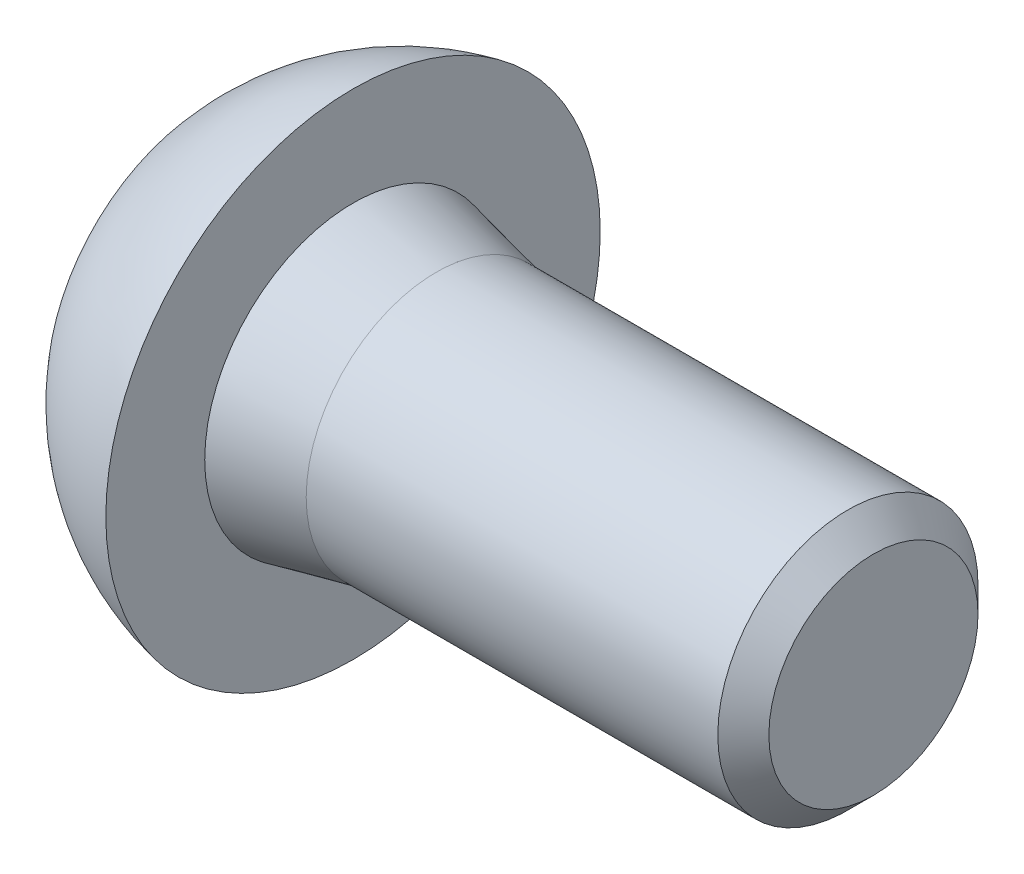
ISO-10303-21;
HEADER;
FILE_DESCRIPTION(('STEP AP214'),'2;1');
FILE_NAME('part.step','',(''),(''),'','','');
FILE_SCHEMA(('AUTOMOTIVE_DESIGN { 1 0 10303 214 1 1 1 1 }'));
ENDSEC;
DATA;
#1=APPLICATION_CONTEXT('core data for automotive mechanical design processes');
#2=APPLICATION_PROTOCOL_DEFINITION('international standard','automotive_design',2000,#1);
#3=PRODUCT_CONTEXT('',#1,'mechanical');
#4=PRODUCT('Part','Part','',(#3));
#5=PRODUCT_RELATED_PRODUCT_CATEGORY('part','',(#4));
#6=PRODUCT_DEFINITION_FORMATION('','',#4);
#7=PRODUCT_DEFINITION_CONTEXT('part definition',#1,'design');
#8=PRODUCT_DEFINITION('design','',#6,#7);
#9=PRODUCT_DEFINITION_SHAPE('','',#8);
#10=(LENGTH_UNIT() NAMED_UNIT(*) SI_UNIT(.MILLI.,.METRE.));
#11=(NAMED_UNIT(*) PLANE_ANGLE_UNIT() SI_UNIT($,.RADIAN.));
#12=(NAMED_UNIT(*) SI_UNIT($,.STERADIAN.) SOLID_ANGLE_UNIT());
#13=UNCERTAINTY_MEASURE_WITH_UNIT(LENGTH_MEASURE(1.E-05),#10,'distance_accuracy_value','');
#14=(GEOMETRIC_REPRESENTATION_CONTEXT(3) GLOBAL_UNCERTAINTY_ASSIGNED_CONTEXT((#13)) GLOBAL_UNIT_ASSIGNED_CONTEXT((#10,
#11,#12)) REPRESENTATION_CONTEXT('',''));
#15=CARTESIAN_POINT('',(0.,0.,0.));
#16=DIRECTION('',(0.,0.,1.));
#17=DIRECTION('',(1.,0.,0.));
#18=AXIS2_PLACEMENT_3D('',#15,#16,#17);
#19=CARTESIAN_POINT('',(-2.75,1.50000000000106,-1.19348975147204E-12));
#20=DIRECTION('',(1.00000000000001,0.,0.));
#21=DIRECTION('',(0.,0.,-1.00000000000004));
#22=AXIS2_PLACEMENT_3D('',#19,#20,#21);
#23=PLANE('',#22);
#24=CARTESIAN_POINT('',(-2.75000000000003,-4.77395900588817E-12,0.));
#25=DIRECTION('',(1.00000000000001,0.,0.));
#26=DIRECTION('',(0.,0.,-1.00000000000004));
#27=AXIS2_PLACEMENT_3D('',#24,#25,#26);
#28=CIRCLE('',#27,3.125);
#29=CARTESIAN_POINT('',(-2.75000000000004,-4.77699477197113E-12,-3.12500000000019));
#30=VERTEX_POINT('',#29);
#31=EDGE_CURVE('E135',#30,#30,#28,.T.);
#32=ORIENTED_EDGE('',*,*,#31,.F.);
#33=EDGE_LOOP('',(#32));
#34=FACE_BOUND('',#33,.T.);
#35=DIRECTION('',(0.,-0.500000000000013,0.86602540378447));
#36=VECTOR('',#35,1.);
#37=CARTESIAN_POINT('',(-2.74999999999907,-0.924038105679093,-1.39951905283892));
#38=LINE('',#37,#36);
#39=CARTESIAN_POINT('',(-2.74999999999907,-0.866025403784332,-1.50000000000117));
#40=VERTEX_POINT('',#39);
#41=CARTESIAN_POINT('',(-2.74999999999946,-1.73205080756822,-1.38777878078145E-12));
#42=VERTEX_POINT('',#41);
#43=EDGE_CURVE('E11',#40,#42,#38,.T.);
#44=ORIENTED_EDGE('',*,*,#43,.F.);
#45=DIRECTION('',(0.,-1.00000000000003,0.));
#46=VECTOR('',#45,1.);
#47=CARTESIAN_POINT('',(-2.74999999999948,1.49999999999939,-1.50000000000089));
#48=LINE('',#47,#46);
#49=CARTESIAN_POINT('',(-2.74999999999925,0.866025403785109,-1.49999999999981));
#50=VERTEX_POINT('',#49);
#51=EDGE_CURVE('E148',#50,#40,#48,.T.);
#52=ORIENTED_EDGE('',*,*,#51,.F.);
#53=DIRECTION('',(0.,-0.500000000000014,-0.866025403784471));
#54=VECTOR('',#53,1.);
#55=CARTESIAN_POINT('',(-2.74999999999967,1.67403810567668,-0.100480947162446));
#56=LINE('',#55,#54);
#57=CARTESIAN_POINT('',(-2.75,1.73205080756911,-6.93889390390723E-13));
#58=VERTEX_POINT('',#57);
#59=EDGE_CURVE('E144',#58,#50,#56,.T.);
#60=ORIENTED_EDGE('',*,*,#59,.F.);
#61=DIRECTION('',(0.,0.500000000000013,-0.86602540378447));
#62=VECTOR('',#61,1.);
#63=CARTESIAN_POINT('',(-2.75,1.67403810567501,0.100480947161419));
#64=LINE('',#63,#62);
#65=CARTESIAN_POINT('',(-2.75000000000107,0.866025403783555,1.49999999999953));
#66=VERTEX_POINT('',#65);
#67=EDGE_CURVE('E141',#66,#58,#64,.T.);
#68=ORIENTED_EDGE('',*,*,#67,.F.);
#69=DIRECTION('',(0.,1.00000000000003,0.));
#70=VECTOR('',#69,1.);
#71=CARTESIAN_POINT('',(-2.75000000000083,1.50000000000239,1.50000000000053));
#72=LINE('',#71,#70);
#73=CARTESIAN_POINT('',(-2.75000000000068,-0.866025403784776,1.49999999999981));
#74=VERTEX_POINT('',#73);
#75=EDGE_CURVE('E146',#74,#66,#72,.T.);
#76=ORIENTED_EDGE('',*,*,#75,.F.);
#77=DIRECTION('',(0.,0.500000000000014,0.866025403784471));
#78=VECTOR('',#77,1.);
#79=CARTESIAN_POINT('',(-2.75000000000078,-0.924038105677982,1.39951905283836));
#80=LINE('',#79,#78);
#81=EDGE_CURVE('E25',#42,#74,#80,.T.);
#82=ORIENTED_EDGE('',*,*,#81,.F.);
#83=EDGE_LOOP('',(#44,#52,#60,#68,#76,#82));
#84=FACE_BOUND('',#83,.T.);
#85=ADVANCED_FACE('F17',(#34,#84),#23,.F.);
#86=CARTESIAN_POINT('',(0.900773085666162,-1.99840144432528E-12,-5.27355936696949E-13));
#87=DIRECTION('',(1.00000000000001,0.,0.));
#88=DIRECTION('',(0.,0.,-1.00000000000004));
#89=AXIS2_PLACEMENT_3D('',#86,#87,#88);
#90=DEGENERATE_TOROIDAL_SURFACE('',#89,0.086191701180338,4.74999999999997,.T.);
#91=ORIENTED_EDGE('',*,*,#31,.T.);
#92=EDGE_LOOP('',(#91));
#93=FACE_BOUND('',#92,.T.);
#94=CARTESIAN_POINT('',(0.,0.,0.));
#95=DIRECTION('',(1.00000000000001,0.,0.));
#96=DIRECTION('',(0.,0.,-1.00000000000004));
#97=AXIS2_PLACEMENT_3D('',#94,#95,#96);
#98=CIRCLE('',#97,4.75);
#99=CARTESIAN_POINT('',(0.,0.,-4.75000000000017));
#100=VERTEX_POINT('',#99);
#101=EDGE_CURVE('E132',#100,#100,#98,.T.);
#102=ORIENTED_EDGE('',*,*,#101,.F.);
#103=EDGE_LOOP('',(#102));
#104=FACE_BOUND('',#103,.T.);
#105=ADVANCED_FACE('F220',(#93,#104),#90,.T.);
#106=CARTESIAN_POINT('',(-4.16333634234434E-13,4.75000000000159,1.11022302462516E-13));
#107=DIRECTION('',(-1.00000000000001,0.,0.));
#108=DIRECTION('',(0.,0.,1.00000000000004));
#109=AXIS2_PLACEMENT_3D('',#106,#107,#108);
#110=PLANE('',#109);
#111=CARTESIAN_POINT('',(0.,0.,0.));
#112=DIRECTION('',(1.00000000000001,0.,0.));
#113=DIRECTION('',(0.,0.,-1.00000000000004));
#114=AXIS2_PLACEMENT_3D('',#111,#112,#113);
#115=CIRCLE('',#114,2.85);
#116=CARTESIAN_POINT('',(0.,0.,-2.8500000000001));
#117=VERTEX_POINT('',#116);
#118=EDGE_CURVE('E129',#117,#117,#115,.T.);
#119=ORIENTED_EDGE('',*,*,#118,.F.);
#120=EDGE_LOOP('',(#119));
#121=FACE_BOUND('',#120,.T.);
#122=ORIENTED_EDGE('',*,*,#101,.T.);
#123=EDGE_LOOP('',(#122));
#124=FACE_BOUND('',#123,.T.);
#125=ADVANCED_FACE('F225',(#121,#124),#110,.F.);
#126=CARTESIAN_POINT('',(0.,0.,0.));
#127=DIRECTION('',(-1.00000000000001,0.,0.));
#128=DIRECTION('',(0.,0.,1.00000000000004));
#129=AXIS2_PLACEMENT_3D('',#126,#127,#128);
#130=CONICAL_SURFACE('',#129,2.85,0.215357699697738);
#131=CARTESIAN_POINT('',(1.59999999999999,-2.88657986402541E-12,0.));
#132=DIRECTION('',(1.00000000000001,0.,0.));
#133=DIRECTION('',(0.,0.,-1.00000000000004));
#134=AXIS2_PLACEMENT_3D('',#131,#132,#133);
#135=CIRCLE('',#134,2.5);
#136=CARTESIAN_POINT('',(1.59999999999999,-2.88900847689177E-12,-2.50000000000012));
#137=VERTEX_POINT('',#136);
#138=EDGE_CURVE('E126',#137,#137,#135,.T.);
#139=ORIENTED_EDGE('',*,*,#138,.F.);
#140=EDGE_LOOP('',(#139));
#141=FACE_BOUND('',#140,.T.);
#142=ORIENTED_EDGE('',*,*,#118,.T.);
#143=EDGE_LOOP('',(#142));
#144=FACE_BOUND('',#143,.T.);
#145=ADVANCED_FACE('F232',(#141,#144),#130,.T.);
#146=CARTESIAN_POINT('',(10.,-2.66453525910038E-12,-9.71445146547012E-13));
#147=DIRECTION('',(1.00000000000001,0.,0.));
#148=DIRECTION('',(0.,0.,-1.00000000000004));
#149=AXIS2_PLACEMENT_3D('',#146,#147,#148);
#150=CYLINDRICAL_SURFACE('',#149,2.5);
#151=CARTESIAN_POINT('',(9.5095,-1.11022302462516E-12,-9.15933995315754E-13));
#152=DIRECTION('',(1.00000000000001,0.,0.));
#153=DIRECTION('',(0.,0.,-1.00000000000004));
#154=AXIS2_PLACEMENT_3D('',#151,#152,#153);
#155=CIRCLE('',#154,2.5);
#156=CARTESIAN_POINT('',(9.5095,-1.11265163749152E-12,-2.50000000000101));
#157=VERTEX_POINT('',#156);
#158=EDGE_CURVE('E118',#157,#157,#155,.T.);
#159=ORIENTED_EDGE('',*,*,#158,.F.);
#160=EDGE_LOOP('',(#159));
#161=FACE_BOUND('',#160,.T.);
#162=ORIENTED_EDGE('',*,*,#138,.T.);
#163=EDGE_LOOP('',(#162));
#164=FACE_BOUND('',#163,.T.);
#165=ADVANCED_FACE('F236',(#161,#164),#150,.T.);
#166=CARTESIAN_POINT('',(9.5095,-1.11022302462516E-12,-9.15933995315754E-13));
#167=DIRECTION('',(-1.00000000000001,0.,0.));
#168=DIRECTION('',(0.,0.,1.00000000000004));
#169=AXIS2_PLACEMENT_3D('',#166,#167,#168);
#170=CONICAL_SURFACE('',#169,2.5,0.785398163397447);
#171=CARTESIAN_POINT('',(10.,-2.66453525910038E-12,-9.71445146547012E-13));
#172=DIRECTION('',(1.00000000000001,0.,0.));
#173=DIRECTION('',(0.,0.,-1.00000000000004));
#174=AXIS2_PLACEMENT_3D('',#171,#172,#173);
#175=CIRCLE('',#174,2.0095);
#176=CARTESIAN_POINT('',(10.,-2.66648737812236E-12,-2.00950000000104));
#177=VERTEX_POINT('',#176);
#178=EDGE_CURVE('E114',#177,#177,#175,.T.);
#179=ORIENTED_EDGE('',*,*,#178,.F.);
#180=EDGE_LOOP('',(#179));
#181=FACE_BOUND('',#180,.T.);
#182=ORIENTED_EDGE('',*,*,#158,.T.);
#183=EDGE_LOOP('',(#182));
#184=FACE_BOUND('',#183,.T.);
#185=ADVANCED_FACE('F240',(#181,#184),#170,.T.);
#186=CARTESIAN_POINT('',(10.0000000000001,2.00949999999833,-9.71445146547012E-13));
#187=DIRECTION('',(-1.00000000000001,0.,0.));
#188=DIRECTION('',(0.,0.,1.00000000000004));
#189=AXIS2_PLACEMENT_3D('',#186,#187,#188);
#190=PLANE('',#189);
#191=ORIENTED_EDGE('',*,*,#178,.T.);
#192=EDGE_LOOP('',(#191));
#193=FACE_BOUND('',#192,.T.);
#194=ADVANCED_FACE('F244',(#193),#190,.F.);
#195=CARTESIAN_POINT('',(-1.19000000000002,-2.44249065417534E-12,1.38777878078145E-13));
#196=DIRECTION('',(1.00000000000001,0.,0.));
#197=DIRECTION('',(0.,0.,-1.00000000000004));
#198=AXIS2_PLACEMENT_3D('',#195,#196,#197);
#199=PLANE('',#198);
#200=DIRECTION('',(0.,1.00000000000003,0.));
#201=VECTOR('',#200,1.);
#202=CARTESIAN_POINT('',(-1.18999999999907,-0.866025403786552,-1.50000000000142));
#203=LINE('',#202,#201);
#204=CARTESIAN_POINT('',(-1.18999999999907,-0.866025403786552,-1.50000000000142));
#205=VERTEX_POINT('',#204);
#206=CARTESIAN_POINT('',(-1.18999999999937,7.7715611723761E-13,-1.50000000000042));
#207=VERTEX_POINT('',#206);
#208=EDGE_CURVE('E32',#205,#207,#203,.T.);
#209=ORIENTED_EDGE('',*,*,#208,.F.);
#210=DIRECTION('',(0.,0.500000000000013,-0.86602540378447));
#211=VECTOR('',#210,1.);
#212=CARTESIAN_POINT('',(-1.18999999999946,-1.73205080756744,-9.71445146547012E-13));
#213=LINE('',#212,#211);
#214=CARTESIAN_POINT('',(-1.1899999999995,-1.29903810567455,-0.750000000000056));
#215=VERTEX_POINT('',#214);
#216=EDGE_CURVE('E108',#215,#205,#213,.T.);
#217=ORIENTED_EDGE('',*,*,#216,.F.);
#218=CARTESIAN_POINT('',(-1.19000000000002,-2.44249065417534E-12,1.38777878078145E-13));
#219=DIRECTION('',(1.00000000000001,0.,0.));
#220=DIRECTION('',(0.,0.,-1.00000000000004));
#221=AXIS2_PLACEMENT_3D('',#218,#219,#220);
#222=CIRCLE('',#221,1.5);
#223=EDGE_CURVE('E193',#215,#207,#222,.T.);
#224=ORIENTED_EDGE('',*,*,#223,.T.);
#225=EDGE_LOOP('',(#209,#217,#224));
#226=FACE_BOUND('',#225,.T.);
#227=ADVANCED_FACE('F196',(#226),#199,.F.);
#228=CARTESIAN_POINT('',(-1.18999999999946,-1.73205080756744,-9.71445146547012E-13));
#229=VERTEX_POINT('',#228);
#230=EDGE_CURVE('E186',#229,#215,#213,.T.);
#231=ORIENTED_EDGE('',*,*,#230,.F.);
#232=DIRECTION('',(0.,-0.500000000000014,-0.866025403784471));
#233=VECTOR('',#232,1.);
#234=CARTESIAN_POINT('',(-1.19000000000057,-0.866025403784776,1.49999999999947));
#235=LINE('',#234,#233);
#236=CARTESIAN_POINT('',(-1.1900000000002,-1.29903810567644,0.749999999999834));
#237=VERTEX_POINT('',#236);
#238=EDGE_CURVE('E109',#237,#229,#235,.T.);
#239=ORIENTED_EDGE('',*,*,#238,.F.);
#240=EDGE_CURVE('E191',#237,#215,#222,.T.);
#241=ORIENTED_EDGE('',*,*,#240,.T.);
#242=EDGE_LOOP('',(#231,#239,#241));
#243=FACE_BOUND('',#242,.T.);
#244=ADVANCED_FACE('F190',(#243),#199,.F.);
#245=CARTESIAN_POINT('',(-1.19000000000057,-0.866025403784776,1.49999999999947));
#246=VERTEX_POINT('',#245);
#247=EDGE_CURVE('E102',#246,#237,#235,.T.);
#248=ORIENTED_EDGE('',*,*,#247,.F.);
#249=DIRECTION('',(0.,-1.00000000000003,0.));
#250=VECTOR('',#249,1.);
#251=CARTESIAN_POINT('',(-1.19000000000107,0.866025403784443,1.49999999999914));
#252=LINE('',#251,#250);
#253=CARTESIAN_POINT('',(-1.19000000000108,-1.33226762955019E-12,1.50000000000045));
#254=VERTEX_POINT('',#253);
#255=EDGE_CURVE('E89',#254,#246,#252,.T.);
#256=ORIENTED_EDGE('',*,*,#255,.F.);
#257=EDGE_CURVE('E104',#254,#237,#222,.T.);
#258=ORIENTED_EDGE('',*,*,#257,.T.);
#259=EDGE_LOOP('',(#248,#256,#258));
#260=FACE_BOUND('',#259,.T.);
#261=ADVANCED_FACE('F103',(#260),#199,.F.);
#262=CARTESIAN_POINT('',(-1.19000000000107,0.866025403784443,1.49999999999914));
#263=VERTEX_POINT('',#262);
#264=EDGE_CURVE('E97',#263,#254,#252,.T.);
#265=ORIENTED_EDGE('',*,*,#264,.F.);
#266=DIRECTION('',(0.,-0.500000000000013,0.86602540378447));
#267=VECTOR('',#266,1.);
#268=CARTESIAN_POINT('',(-1.19,1.73205080756755,0.));
#269=LINE('',#268,#267);
#270=CARTESIAN_POINT('',(-1.19000000000065,1.29903810567489,0.749999999999501));
#271=VERTEX_POINT('',#270);
#272=EDGE_CURVE('E172',#271,#263,#269,.T.);
#273=ORIENTED_EDGE('',*,*,#272,.F.);
#274=EDGE_CURVE('E142',#271,#254,#222,.T.);
#275=ORIENTED_EDGE('',*,*,#274,.T.);
#276=EDGE_LOOP('',(#265,#273,#275));
#277=FACE_BOUND('',#276,.T.);
#278=ADVANCED_FACE('F210',(#277),#199,.F.);
#279=CARTESIAN_POINT('',(-1.19,1.73205080756755,0.));
#280=VERTEX_POINT('',#279);
#281=EDGE_CURVE('E174',#280,#271,#269,.T.);
#282=ORIENTED_EDGE('',*,*,#281,.F.);
#283=DIRECTION('',(0.,0.500000000000014,0.866025403784471));
#284=VECTOR('',#283,1.);
#285=CARTESIAN_POINT('',(-1.18999999999947,0.866025403783444,-1.50000000000017));
#286=LINE('',#285,#284);
#287=CARTESIAN_POINT('',(-1.18999999999955,1.29903810567478,-0.750000000000223));
#288=VERTEX_POINT('',#287);
#289=EDGE_CURVE('E183',#288,#280,#286,.T.);
#290=ORIENTED_EDGE('',*,*,#289,.F.);
#291=EDGE_CURVE('E139',#288,#271,#222,.T.);
#292=ORIENTED_EDGE('',*,*,#291,.T.);
#293=EDGE_LOOP('',(#282,#290,#292));
#294=FACE_BOUND('',#293,.T.);
#295=ADVANCED_FACE('F206',(#294),#199,.F.);
#296=CARTESIAN_POINT('',(-1.18999999999947,0.866025403783444,-1.50000000000017));
#297=VERTEX_POINT('',#296);
#298=EDGE_CURVE('E180',#297,#288,#286,.T.);
#299=ORIENTED_EDGE('',*,*,#298,.F.);
#300=EDGE_CURVE('E185',#207,#297,#203,.T.);
#301=ORIENTED_EDGE('',*,*,#300,.F.);
#302=EDGE_CURVE('E138',#207,#288,#222,.T.);
#303=ORIENTED_EDGE('',*,*,#302,.T.);
#304=EDGE_LOOP('',(#299,#301,#303));
#305=FACE_BOUND('',#304,.T.);
#306=ADVANCED_FACE('F203',(#305),#199,.F.);
#307=CARTESIAN_POINT('',(-1.19000000000107,0.866025403784443,1.49999999999914));
#308=DIRECTION('',(0.,0.,-1.00000000000004));
#309=DIRECTION('',(-1.00000000000001,0.,0.));
#310=AXIS2_PLACEMENT_3D('',#307,#308,#309);
#311=PLANE('',#310);
#312=ORIENTED_EDGE('',*,*,#264,.T.);
#313=ORIENTED_EDGE('',*,*,#255,.T.);
#314=DIRECTION('',(-1.00000000000001,0.,0.));
#315=VECTOR('',#314,1.);
#316=CARTESIAN_POINT('',(-1.19000000000057,-0.866025403784776,1.49999999999947));
#317=LINE('',#316,#315);
#318=EDGE_CURVE('E93',#246,#74,#317,.T.);
#319=ORIENTED_EDGE('',*,*,#318,.T.);
#320=ORIENTED_EDGE('',*,*,#75,.T.);
#321=DIRECTION('',(-1.00000000000001,0.,0.));
#322=VECTOR('',#321,1.);
#323=CARTESIAN_POINT('',(-1.19000000000107,0.866025403784443,1.49999999999914));
#324=LINE('',#323,#322);
#325=EDGE_CURVE('E165',#263,#66,#324,.T.);
#326=ORIENTED_EDGE('',*,*,#325,.F.);
#327=EDGE_LOOP('',(#312,#313,#319,#320,#326));
#328=FACE_BOUND('',#327,.T.);
#329=ADVANCED_FACE('F91',(#328),#311,.T.);
#330=CARTESIAN_POINT('',(-1.19000000000057,-0.866025403784776,1.49999999999947));
#331=DIRECTION('',(0.,0.866025403784464,-0.500000000000017));
#332=DIRECTION('',(0.,0.500000000000014,0.866025403784471));
#333=AXIS2_PLACEMENT_3D('',#330,#331,#332);
#334=PLANE('',#333);
#335=ORIENTED_EDGE('',*,*,#247,.T.);
#336=ORIENTED_EDGE('',*,*,#238,.T.);
#337=DIRECTION('',(-1.00000000000001,0.,0.));
#338=VECTOR('',#337,1.);
#339=CARTESIAN_POINT('',(-1.18999999999946,-1.73205080756744,-9.71445146547012E-13));
#340=LINE('',#339,#338);
#341=EDGE_CURVE('E115',#229,#42,#340,.T.);
#342=ORIENTED_EDGE('',*,*,#341,.T.);
#343=ORIENTED_EDGE('',*,*,#81,.T.);
#344=ORIENTED_EDGE('',*,*,#318,.F.);
#345=EDGE_LOOP('',(#335,#336,#342,#343,#344));
#346=FACE_BOUND('',#345,.T.);
#347=ADVANCED_FACE('F111',(#346),#334,.T.);
#348=CARTESIAN_POINT('',(-1.18999999999946,-1.73205080756744,-9.71445146547012E-13));
#349=DIRECTION('',(0.,0.866025403784466,0.500000000000021));
#350=DIRECTION('',(0.,-0.500000000000013,0.86602540378447));
#351=AXIS2_PLACEMENT_3D('',#348,#349,#350);
#352=PLANE('',#351);
#353=ORIENTED_EDGE('',*,*,#230,.T.);
#354=ORIENTED_EDGE('',*,*,#216,.T.);
#355=DIRECTION('',(-1.00000000000001,0.,0.));
#356=VECTOR('',#355,1.);
#357=CARTESIAN_POINT('',(-1.18999999999907,-0.866025403786552,-1.50000000000142));
#358=LINE('',#357,#356);
#359=EDGE_CURVE('E120',#205,#40,#358,.T.);
#360=ORIENTED_EDGE('',*,*,#359,.T.);
#361=ORIENTED_EDGE('',*,*,#43,.T.);
#362=ORIENTED_EDGE('',*,*,#341,.F.);
#363=EDGE_LOOP('',(#353,#354,#360,#361,#362));
#364=FACE_BOUND('',#363,.T.);
#365=ADVANCED_FACE('F160',(#364),#352,.T.);
#366=CARTESIAN_POINT('',(-1.18999999999907,-0.866025403786552,-1.50000000000142));
#367=DIRECTION('',(0.,0.,1.00000000000004));
#368=DIRECTION('',(1.00000000000001,0.,0.));
#369=AXIS2_PLACEMENT_3D('',#366,#367,#368);
#370=PLANE('',#369);
#371=ORIENTED_EDGE('',*,*,#208,.T.);
#372=ORIENTED_EDGE('',*,*,#300,.T.);
#373=DIRECTION('',(-1.00000000000001,0.,0.));
#374=VECTOR('',#373,1.);
#375=CARTESIAN_POINT('',(-1.18999999999947,0.866025403783444,-1.50000000000017));
#376=LINE('',#375,#374);
#377=EDGE_CURVE('E154',#297,#50,#376,.T.);
#378=ORIENTED_EDGE('',*,*,#377,.T.);
#379=ORIENTED_EDGE('',*,*,#51,.T.);
#380=ORIENTED_EDGE('',*,*,#359,.F.);
#381=EDGE_LOOP('',(#371,#372,#378,#379,#380));
#382=FACE_BOUND('',#381,.T.);
#383=ADVANCED_FACE('F152',(#382),#370,.T.);
#384=CARTESIAN_POINT('',(-1.18999999999947,0.866025403783444,-1.50000000000017));
#385=DIRECTION('',(0.,-0.866025403784464,0.500000000000017));
#386=DIRECTION('',(0.,-0.500000000000014,-0.866025403784471));
#387=AXIS2_PLACEMENT_3D('',#384,#385,#386);
#388=PLANE('',#387);
#389=ORIENTED_EDGE('',*,*,#298,.T.);
#390=ORIENTED_EDGE('',*,*,#289,.T.);
#391=DIRECTION('',(-1.00000000000001,0.,0.));
#392=VECTOR('',#391,1.);
#393=CARTESIAN_POINT('',(-1.19,1.73205080756755,0.));
#394=LINE('',#393,#392);
#395=EDGE_CURVE('E173',#280,#58,#394,.T.);
#396=ORIENTED_EDGE('',*,*,#395,.T.);
#397=ORIENTED_EDGE('',*,*,#59,.T.);
#398=ORIENTED_EDGE('',*,*,#377,.F.);
#399=EDGE_LOOP('',(#389,#390,#396,#397,#398));
#400=FACE_BOUND('',#399,.T.);
#401=ADVANCED_FACE('F208',(#400),#388,.T.);
#402=CARTESIAN_POINT('',(-1.19,1.73205080756755,0.));
#403=DIRECTION('',(0.,-0.866025403784466,-0.500000000000021));
#404=DIRECTION('',(0.,0.500000000000013,-0.86602540378447));
#405=AXIS2_PLACEMENT_3D('',#402,#403,#404);
#406=PLANE('',#405);
#407=ORIENTED_EDGE('',*,*,#281,.T.);
#408=ORIENTED_EDGE('',*,*,#272,.T.);
#409=ORIENTED_EDGE('',*,*,#325,.T.);
#410=ORIENTED_EDGE('',*,*,#67,.T.);
#411=ORIENTED_EDGE('',*,*,#395,.F.);
#412=EDGE_LOOP('',(#407,#408,#409,#410,#411));
#413=FACE_BOUND('',#412,.T.);
#414=ADVANCED_FACE('F168',(#413),#406,.T.);
#415=CARTESIAN_POINT('',(-0.323974596215582,1.11022302462516E-12,0.));
#416=DIRECTION('',(-1.00000000000001,0.,0.));
#417=DIRECTION('',(0.,0.,1.00000000000004));
#418=AXIS2_PLACEMENT_3D('',#415,#416,#417);
#419=CONICAL_SURFACE('',#418,0.,1.0471975511966);
#420=ORIENTED_EDGE('',*,*,#291,.F.);
#421=ORIENTED_EDGE('',*,*,#302,.F.);
#422=ORIENTED_EDGE('',*,*,#223,.F.);
#423=ORIENTED_EDGE('',*,*,#240,.F.);
#424=ORIENTED_EDGE('',*,*,#257,.F.);
#425=ORIENTED_EDGE('',*,*,#274,.F.);
#426=EDGE_LOOP('',(#420,#421,#422,#423,#424,#425));
#427=FACE_BOUND('',#426,.T.);
#428=CARTESIAN_POINT('',(-0.323974596215582,1.11022302462516E-12,0.));
#429=VERTEX_POINT('',#428);
#430=VERTEX_LOOP('',#429);
#431=FACE_BOUND('',#430,.T.);
#432=ADVANCED_FACE('F19',(#427,#431),#419,.F.);
#433=CLOSED_SHELL('',(#85,#105,#125,#145,#165,#185,#194,#227,#244,#261,#278,#295,#306,#329,#347,
#365,#383,#401,#414,#432));
#434=MANIFOLD_SOLID_BREP('B1',#433);
#435=ADVANCED_BREP_SHAPE_REPRESENTATION('',(#18,#434),#14);
#436=SHAPE_DEFINITION_REPRESENTATION(#9,#435);
ENDSEC;
END-ISO-10303-21;
